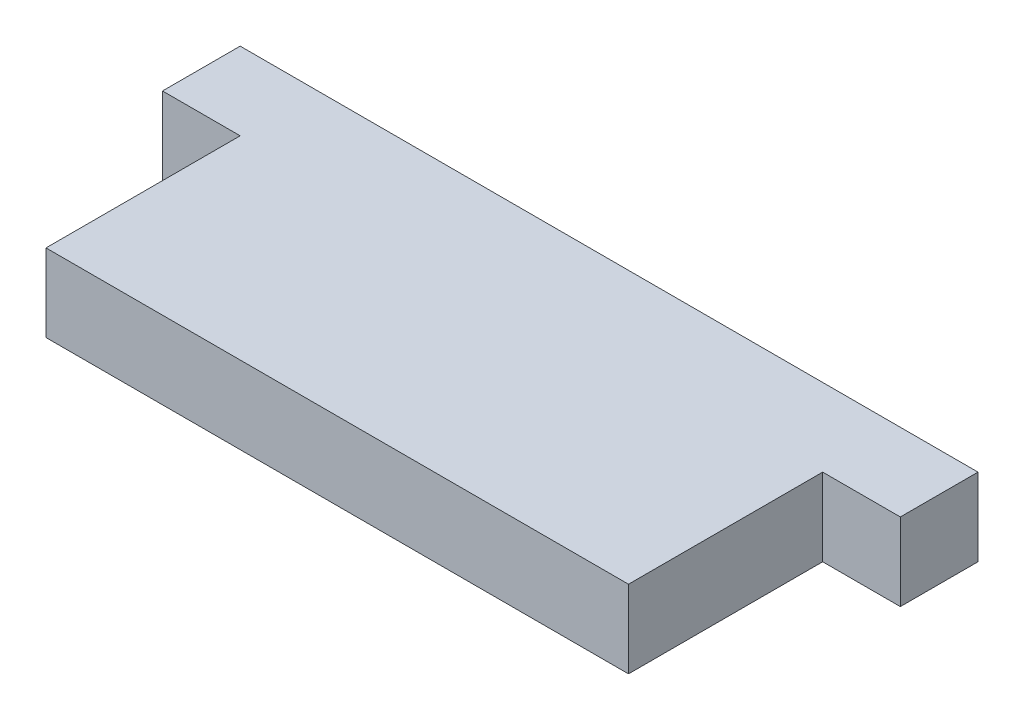
ISO-10303-21;
HEADER;
FILE_DESCRIPTION(('STEP AP214'),'2;1');
FILE_NAME('part.step','',(''),(''),'','','');
FILE_SCHEMA(('AUTOMOTIVE_DESIGN { 1 0 10303 214 1 1 1 1 }'));
ENDSEC;
DATA;
#1=APPLICATION_CONTEXT('core data for automotive mechanical design processes');
#2=APPLICATION_PROTOCOL_DEFINITION('international standard','automotive_design',2000,#1);
#3=PRODUCT_CONTEXT('',#1,'mechanical');
#4=PRODUCT('Part','Part','',(#3));
#5=PRODUCT_RELATED_PRODUCT_CATEGORY('part','',(#4));
#6=PRODUCT_DEFINITION_FORMATION('','',#4);
#7=PRODUCT_DEFINITION_CONTEXT('part definition',#1,'design');
#8=PRODUCT_DEFINITION('design','',#6,#7);
#9=PRODUCT_DEFINITION_SHAPE('','',#8);
#10=(LENGTH_UNIT() NAMED_UNIT(*) SI_UNIT(.MILLI.,.METRE.));
#11=(NAMED_UNIT(*) PLANE_ANGLE_UNIT() SI_UNIT($,.RADIAN.));
#12=(NAMED_UNIT(*) SI_UNIT($,.STERADIAN.) SOLID_ANGLE_UNIT());
#13=UNCERTAINTY_MEASURE_WITH_UNIT(LENGTH_MEASURE(1.E-05),#10,'distance_accuracy_value','');
#14=(GEOMETRIC_REPRESENTATION_CONTEXT(3) GLOBAL_UNCERTAINTY_ASSIGNED_CONTEXT((#13)) GLOBAL_UNIT_ASSIGNED_CONTEXT((#10,
#11,#12)) REPRESENTATION_CONTEXT('',''));
#15=CARTESIAN_POINT('',(0.,0.,0.));
#16=DIRECTION('',(0.,0.,1.));
#17=DIRECTION('',(1.,0.,0.));
#18=AXIS2_PLACEMENT_3D('',#15,#16,#17);
#19=CARTESIAN_POINT('',(-7.5,1.,5.));
#20=DIRECTION('',(1.,0.,0.));
#21=DIRECTION('',(0.,0.,-1.));
#22=AXIS2_PLACEMENT_3D('',#19,#20,#21);
#23=PLANE('',#22);
#24=DIRECTION('',(0.,-1.,0.));
#25=VECTOR('',#24,1.);
#26=CARTESIAN_POINT('',(-7.5,1.,0.));
#27=LINE('',#26,#25);
#28=CARTESIAN_POINT('',(-7.5,1.,0.));
#29=VERTEX_POINT('',#28);
#30=CARTESIAN_POINT('',(-7.5,-1.,0.));
#31=VERTEX_POINT('',#30);
#32=EDGE_CURVE('E118',#29,#31,#27,.T.);
#33=ORIENTED_EDGE('',*,*,#32,.T.);
#34=DIRECTION('',(0.,0.,-1.));
#35=VECTOR('',#34,1.);
#36=CARTESIAN_POINT('',(-7.5,-1.,5.));
#37=LINE('',#36,#35);
#38=CARTESIAN_POINT('',(-7.5,-1.,5.));
#39=VERTEX_POINT('',#38);
#40=EDGE_CURVE('E11',#39,#31,#37,.T.);
#41=ORIENTED_EDGE('',*,*,#40,.F.);
#42=DIRECTION('',(0.,-1.,0.));
#43=VECTOR('',#42,1.);
#44=CARTESIAN_POINT('',(-7.5,1.,5.));
#45=LINE('',#44,#43);
#46=CARTESIAN_POINT('',(-7.5,1.,5.));
#47=VERTEX_POINT('',#46);
#48=EDGE_CURVE('E127',#47,#39,#45,.T.);
#49=ORIENTED_EDGE('',*,*,#48,.F.);
#50=DIRECTION('',(0.,0.,-1.));
#51=VECTOR('',#50,1.);
#52=CARTESIAN_POINT('',(-7.5,1.,5.));
#53=LINE('',#52,#51);
#54=EDGE_CURVE('E133',#47,#29,#53,.T.);
#55=ORIENTED_EDGE('',*,*,#54,.T.);
#56=EDGE_LOOP('',(#33,#41,#49,#55));
#57=FACE_BOUND('',#56,.T.);
#58=ADVANCED_FACE('F32',(#57),#23,.F.);
#59=CARTESIAN_POINT('',(-7.5,-1.,5.));
#60=DIRECTION('',(0.,1.,0.));
#61=DIRECTION('',(0.,0.,1.));
#62=AXIS2_PLACEMENT_3D('',#59,#60,#61);
#63=PLANE('',#62);
#64=ORIENTED_EDGE('',*,*,#40,.T.);
#65=DIRECTION('',(-1.,0.,0.));
#66=VECTOR('',#65,1.);
#67=CARTESIAN_POINT('',(9.5,-1.,0.));
#68=LINE('',#67,#66);
#69=CARTESIAN_POINT('',(-9.5,-1.,0.));
#70=VERTEX_POINT('',#69);
#71=EDGE_CURVE('E150',#31,#70,#68,.T.);
#72=ORIENTED_EDGE('',*,*,#71,.T.);
#73=DIRECTION('',(0.,0.,1.));
#74=VECTOR('',#73,1.);
#75=CARTESIAN_POINT('',(-9.5,-1.,-2.));
#76=LINE('',#75,#74);
#77=CARTESIAN_POINT('',(-9.5,-1.,-2.));
#78=VERTEX_POINT('',#77);
#79=EDGE_CURVE('E100',#78,#70,#76,.T.);
#80=ORIENTED_EDGE('',*,*,#79,.F.);
#81=DIRECTION('',(-1.,0.,0.));
#82=VECTOR('',#81,1.);
#83=CARTESIAN_POINT('',(9.5,-1.,-2.));
#84=LINE('',#83,#82);
#85=CARTESIAN_POINT('',(9.5,-1.,-2.));
#86=VERTEX_POINT('',#85);
#87=EDGE_CURVE('E92',#86,#78,#84,.T.);
#88=ORIENTED_EDGE('',*,*,#87,.F.);
#89=DIRECTION('',(0.,0.,1.));
#90=VECTOR('',#89,1.);
#91=CARTESIAN_POINT('',(9.5,-1.,-2.));
#92=LINE('',#91,#90);
#93=CARTESIAN_POINT('',(9.5,-1.,0.));
#94=VERTEX_POINT('',#93);
#95=EDGE_CURVE('E97',#86,#94,#92,.T.);
#96=ORIENTED_EDGE('',*,*,#95,.T.);
#97=CARTESIAN_POINT('',(7.5,-1.,0.));
#98=VERTEX_POINT('',#97);
#99=EDGE_CURVE('E147',#94,#98,#68,.T.);
#100=ORIENTED_EDGE('',*,*,#99,.T.);
#101=DIRECTION('',(0.,0.,-1.));
#102=VECTOR('',#101,1.);
#103=CARTESIAN_POINT('',(7.5,-1.,5.));
#104=LINE('',#103,#102);
#105=CARTESIAN_POINT('',(7.5,-1.,5.));
#106=VERTEX_POINT('',#105);
#107=EDGE_CURVE('E40',#106,#98,#104,.T.);
#108=ORIENTED_EDGE('',*,*,#107,.F.);
#109=DIRECTION('',(1.,0.,0.));
#110=VECTOR('',#109,1.);
#111=CARTESIAN_POINT('',(-7.5,-1.,5.));
#112=LINE('',#111,#110);
#113=EDGE_CURVE('E129',#39,#106,#112,.T.);
#114=ORIENTED_EDGE('',*,*,#113,.F.);
#115=EDGE_LOOP('',(#64,#72,#80,#88,#96,#100,#108,#114));
#116=FACE_BOUND('',#115,.T.);
#117=ADVANCED_FACE('F94',(#116),#63,.F.);
#118=CARTESIAN_POINT('',(7.5,1.,5.));
#119=DIRECTION('',(-1.,0.,0.));
#120=DIRECTION('',(0.,0.,1.));
#121=AXIS2_PLACEMENT_3D('',#118,#119,#120);
#122=PLANE('',#121);
#123=DIRECTION('',(0.,1.,0.));
#124=VECTOR('',#123,1.);
#125=CARTESIAN_POINT('',(7.5,1.,0.));
#126=LINE('',#125,#124);
#127=CARTESIAN_POINT('',(7.5,1.,0.));
#128=VERTEX_POINT('',#127);
#129=EDGE_CURVE('E121',#98,#128,#126,.T.);
#130=ORIENTED_EDGE('',*,*,#129,.T.);
#131=DIRECTION('',(0.,0.,-1.));
#132=VECTOR('',#131,1.);
#133=CARTESIAN_POINT('',(7.5,1.,5.));
#134=LINE('',#133,#132);
#135=CARTESIAN_POINT('',(7.5,1.,5.));
#136=VERTEX_POINT('',#135);
#137=EDGE_CURVE('E139',#136,#128,#134,.T.);
#138=ORIENTED_EDGE('',*,*,#137,.F.);
#139=DIRECTION('',(0.,1.,0.));
#140=VECTOR('',#139,1.);
#141=CARTESIAN_POINT('',(7.5,1.,5.));
#142=LINE('',#141,#140);
#143=EDGE_CURVE('E131',#106,#136,#142,.T.);
#144=ORIENTED_EDGE('',*,*,#143,.F.);
#145=ORIENTED_EDGE('',*,*,#107,.T.);
#146=EDGE_LOOP('',(#130,#138,#144,#145));
#147=FACE_BOUND('',#146,.T.);
#148=ADVANCED_FACE('F145',(#147),#122,.F.);
#149=CARTESIAN_POINT('',(-7.5,1.,5.));
#150=DIRECTION('',(0.,-1.,0.));
#151=DIRECTION('',(0.,0.,-1.));
#152=AXIS2_PLACEMENT_3D('',#149,#150,#151);
#153=PLANE('',#152);
#154=ORIENTED_EDGE('',*,*,#137,.T.);
#155=DIRECTION('',(1.,0.,0.));
#156=VECTOR('',#155,1.);
#157=CARTESIAN_POINT('',(9.5,1.,0.));
#158=LINE('',#157,#156);
#159=CARTESIAN_POINT('',(9.5,1.,0.));
#160=VERTEX_POINT('',#159);
#161=EDGE_CURVE('E152',#128,#160,#158,.T.);
#162=ORIENTED_EDGE('',*,*,#161,.T.);
#163=DIRECTION('',(0.,0.,1.));
#164=VECTOR('',#163,1.);
#165=CARTESIAN_POINT('',(9.5,1.,-2.));
#166=LINE('',#165,#164);
#167=CARTESIAN_POINT('',(9.5,1.,-2.));
#168=VERTEX_POINT('',#167);
#169=EDGE_CURVE('E159',#168,#160,#166,.T.);
#170=ORIENTED_EDGE('',*,*,#169,.F.);
#171=DIRECTION('',(1.,0.,0.));
#172=VECTOR('',#171,1.);
#173=CARTESIAN_POINT('',(9.5,1.,-2.));
#174=LINE('',#173,#172);
#175=CARTESIAN_POINT('',(-9.5,1.,-2.));
#176=VERTEX_POINT('',#175);
#177=EDGE_CURVE('E109',#176,#168,#174,.T.);
#178=ORIENTED_EDGE('',*,*,#177,.F.);
#179=DIRECTION('',(0.,0.,1.));
#180=VECTOR('',#179,1.);
#181=CARTESIAN_POINT('',(-9.5,1.,-2.));
#182=LINE('',#181,#180);
#183=CARTESIAN_POINT('',(-9.5,1.,0.));
#184=VERTEX_POINT('',#183);
#185=EDGE_CURVE('E123',#176,#184,#182,.T.);
#186=ORIENTED_EDGE('',*,*,#185,.T.);
#187=EDGE_CURVE('E113',#184,#29,#158,.T.);
#188=ORIENTED_EDGE('',*,*,#187,.T.);
#189=ORIENTED_EDGE('',*,*,#54,.F.);
#190=DIRECTION('',(-1.,0.,0.));
#191=VECTOR('',#190,1.);
#192=CARTESIAN_POINT('',(-7.5,1.,5.));
#193=LINE('',#192,#191);
#194=EDGE_CURVE('E47',#136,#47,#193,.T.);
#195=ORIENTED_EDGE('',*,*,#194,.F.);
#196=EDGE_LOOP('',(#154,#162,#170,#178,#186,#188,#189,#195));
#197=FACE_BOUND('',#196,.T.);
#198=ADVANCED_FACE('F164',(#197),#153,.F.);
#199=CARTESIAN_POINT('',(0.,0.,5.));
#200=DIRECTION('',(0.,0.,1.));
#201=DIRECTION('',(1.,0.,0.));
#202=AXIS2_PLACEMENT_3D('',#199,#200,#201);
#203=PLANE('',#202);
#204=ORIENTED_EDGE('',*,*,#48,.T.);
#205=ORIENTED_EDGE('',*,*,#113,.T.);
#206=ORIENTED_EDGE('',*,*,#143,.T.);
#207=ORIENTED_EDGE('',*,*,#194,.T.);
#208=EDGE_LOOP('',(#204,#205,#206,#207));
#209=FACE_BOUND('',#208,.T.);
#210=ADVANCED_FACE('F183',(#209),#203,.T.);
#211=CARTESIAN_POINT('',(0.,0.,0.));
#212=DIRECTION('',(0.,0.,-1.));
#213=DIRECTION('',(-1.,0.,0.));
#214=AXIS2_PLACEMENT_3D('',#211,#212,#213);
#215=PLANE('',#214);
#216=ORIENTED_EDGE('',*,*,#32,.F.);
#217=ORIENTED_EDGE('',*,*,#187,.F.);
#218=DIRECTION('',(0.,1.,0.));
#219=VECTOR('',#218,1.);
#220=CARTESIAN_POINT('',(-9.5,1.,0.));
#221=LINE('',#220,#219);
#222=EDGE_CURVE('E149',#70,#184,#221,.T.);
#223=ORIENTED_EDGE('',*,*,#222,.F.);
#224=ORIENTED_EDGE('',*,*,#71,.F.);
#225=EDGE_LOOP('',(#216,#217,#223,#224));
#226=FACE_BOUND('',#225,.T.);
#227=ADVANCED_FACE('F168',(#226),#215,.F.);
#228=CARTESIAN_POINT('',(9.5,1.,-2.));
#229=DIRECTION('',(-1.,0.,0.));
#230=DIRECTION('',(0.,-1.,0.));
#231=AXIS2_PLACEMENT_3D('',#228,#229,#230);
#232=PLANE('',#231);
#233=DIRECTION('',(0.,-1.,0.));
#234=VECTOR('',#233,1.);
#235=CARTESIAN_POINT('',(9.5,1.,0.));
#236=LINE('',#235,#234);
#237=EDGE_CURVE('E117',#160,#94,#236,.T.);
#238=ORIENTED_EDGE('',*,*,#237,.T.);
#239=ORIENTED_EDGE('',*,*,#95,.F.);
#240=DIRECTION('',(0.,-1.,0.));
#241=VECTOR('',#240,1.);
#242=CARTESIAN_POINT('',(9.5,1.,-2.));
#243=LINE('',#242,#241);
#244=EDGE_CURVE('E104',#168,#86,#243,.T.);
#245=ORIENTED_EDGE('',*,*,#244,.F.);
#246=ORIENTED_EDGE('',*,*,#169,.T.);
#247=EDGE_LOOP('',(#238,#239,#245,#246));
#248=FACE_BOUND('',#247,.T.);
#249=ADVANCED_FACE('F115',(#248),#232,.F.);
#250=CARTESIAN_POINT('',(-9.5,1.,-2.));
#251=DIRECTION('',(1.,0.,0.));
#252=DIRECTION('',(0.,1.,0.));
#253=AXIS2_PLACEMENT_3D('',#250,#251,#252);
#254=PLANE('',#253);
#255=ORIENTED_EDGE('',*,*,#222,.T.);
#256=ORIENTED_EDGE('',*,*,#185,.F.);
#257=DIRECTION('',(0.,1.,0.));
#258=VECTOR('',#257,1.);
#259=CARTESIAN_POINT('',(-9.5,1.,-2.));
#260=LINE('',#259,#258);
#261=EDGE_CURVE('E103',#78,#176,#260,.T.);
#262=ORIENTED_EDGE('',*,*,#261,.F.);
#263=ORIENTED_EDGE('',*,*,#79,.T.);
#264=EDGE_LOOP('',(#255,#256,#262,#263));
#265=FACE_BOUND('',#264,.T.);
#266=ADVANCED_FACE('F179',(#265),#254,.F.);
#267=CARTESIAN_POINT('',(0.,0.,-2.));
#268=DIRECTION('',(0.,0.,-1.));
#269=DIRECTION('',(-1.,0.,0.));
#270=AXIS2_PLACEMENT_3D('',#267,#268,#269);
#271=PLANE('',#270);
#272=ORIENTED_EDGE('',*,*,#244,.T.);
#273=ORIENTED_EDGE('',*,*,#87,.T.);
#274=ORIENTED_EDGE('',*,*,#261,.T.);
#275=ORIENTED_EDGE('',*,*,#177,.T.);
#276=EDGE_LOOP('',(#272,#273,#274,#275));
#277=FACE_BOUND('',#276,.T.);
#278=ADVANCED_FACE('F107',(#277),#271,.T.);
#279=ORIENTED_EDGE('',*,*,#129,.F.);
#280=ORIENTED_EDGE('',*,*,#99,.F.);
#281=ORIENTED_EDGE('',*,*,#237,.F.);
#282=ORIENTED_EDGE('',*,*,#161,.F.);
#283=EDGE_LOOP('',(#279,#280,#281,#282));
#284=FACE_BOUND('',#283,.T.);
#285=ADVANCED_FACE('F173',(#284),#215,.F.);
#286=CLOSED_SHELL('',(#58,#117,#148,#198,#210,#227,#249,#266,#278,#285));
#287=MANIFOLD_SOLID_BREP('B2',#286);
#288=ADVANCED_BREP_SHAPE_REPRESENTATION('',(#18,#287),#14);
#289=SHAPE_DEFINITION_REPRESENTATION(#9,#288);
ENDSEC;
END-ISO-10303-21;
